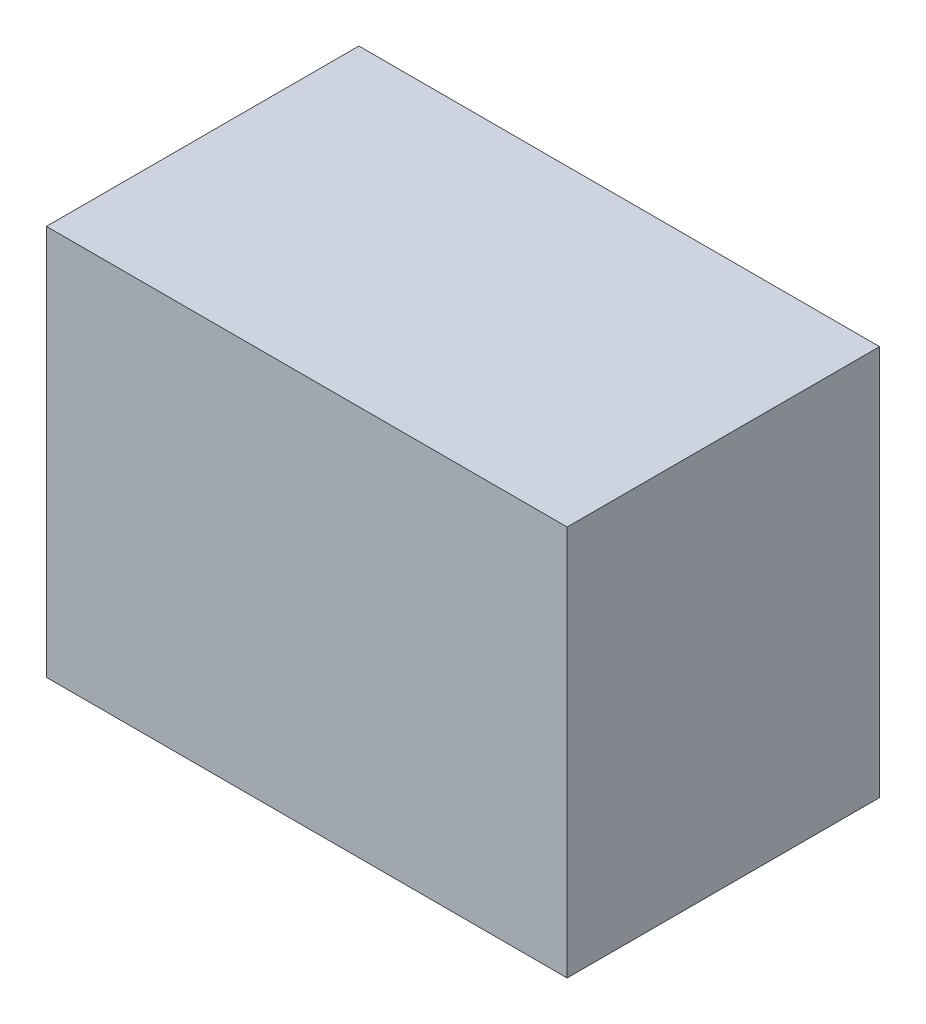
ISO-10303-21;
HEADER;
FILE_DESCRIPTION(('STEP AP214'),'2;1');
FILE_NAME('part.step','',(''),(''),'','','');
FILE_SCHEMA(('AUTOMOTIVE_DESIGN { 1 0 10303 214 1 1 1 1 }'));
ENDSEC;
DATA;
#1=APPLICATION_CONTEXT('core data for automotive mechanical design processes');
#2=APPLICATION_PROTOCOL_DEFINITION('international standard','automotive_design',2000,#1);
#3=PRODUCT_CONTEXT('',#1,'mechanical');
#4=PRODUCT('Part','Part','',(#3));
#5=PRODUCT_RELATED_PRODUCT_CATEGORY('part','',(#4));
#6=PRODUCT_DEFINITION_FORMATION('','',#4);
#7=PRODUCT_DEFINITION_CONTEXT('part definition',#1,'design');
#8=PRODUCT_DEFINITION('design','',#6,#7);
#9=PRODUCT_DEFINITION_SHAPE('','',#8);
#10=(LENGTH_UNIT() NAMED_UNIT(*) SI_UNIT(.MILLI.,.METRE.));
#11=(NAMED_UNIT(*) PLANE_ANGLE_UNIT() SI_UNIT($,.RADIAN.));
#12=(NAMED_UNIT(*) SI_UNIT($,.STERADIAN.) SOLID_ANGLE_UNIT());
#13=UNCERTAINTY_MEASURE_WITH_UNIT(LENGTH_MEASURE(1.E-05),#10,'distance_accuracy_value','');
#14=(GEOMETRIC_REPRESENTATION_CONTEXT(3) GLOBAL_UNCERTAINTY_ASSIGNED_CONTEXT((#13)) GLOBAL_UNIT_ASSIGNED_CONTEXT((#10,
#11,#12)) REPRESENTATION_CONTEXT('',''));
#15=CARTESIAN_POINT('',(0.,0.,0.));
#16=DIRECTION('',(0.,0.,1.));
#17=DIRECTION('',(1.,0.,0.));
#18=AXIS2_PLACEMENT_3D('',#15,#16,#17);
#19=CARTESIAN_POINT('',(0.,0.,12.));
#20=DIRECTION('',(1.,0.,0.));
#21=DIRECTION('',(0.,0.,-1.));
#22=AXIS2_PLACEMENT_3D('',#19,#20,#21);
#23=PLANE('',#22);
#24=DIRECTION('',(0.,-1.,0.));
#25=VECTOR('',#24,1.);
#26=CARTESIAN_POINT('',(0.,0.,0.));
#27=LINE('',#26,#25);
#28=CARTESIAN_POINT('',(0.,15.,0.));
#29=VERTEX_POINT('',#28);
#30=CARTESIAN_POINT('',(0.,0.,0.));
#31=VERTEX_POINT('',#30);
#32=EDGE_CURVE('E164',#29,#31,#27,.T.);
#33=ORIENTED_EDGE('',*,*,#32,.T.);
#34=DIRECTION('',(0.,0.,-1.));
#35=VECTOR('',#34,1.);
#36=CARTESIAN_POINT('',(0.,0.,12.));
#37=LINE('',#36,#35);
#38=CARTESIAN_POINT('',(0.,0.,12.));
#39=VERTEX_POINT('',#38);
#40=EDGE_CURVE('E11',#39,#31,#37,.T.);
#41=ORIENTED_EDGE('',*,*,#40,.F.);
#42=DIRECTION('',(0.,-1.,0.));
#43=VECTOR('',#42,1.);
#44=CARTESIAN_POINT('',(0.,0.,12.));
#45=LINE('',#44,#43);
#46=CARTESIAN_POINT('',(0.,15.,12.));
#47=VERTEX_POINT('',#46);
#48=EDGE_CURVE('E170',#47,#39,#45,.T.);
#49=ORIENTED_EDGE('',*,*,#48,.F.);
#50=DIRECTION('',(0.,0.,-1.));
#51=VECTOR('',#50,1.);
#52=CARTESIAN_POINT('',(0.,15.,12.));
#53=LINE('',#52,#51);
#54=EDGE_CURVE('E180',#47,#29,#53,.T.);
#55=ORIENTED_EDGE('',*,*,#54,.T.);
#56=EDGE_LOOP('',(#33,#41,#49,#55));
#57=FACE_BOUND('',#56,.T.);
#58=ADVANCED_FACE('F45',(#57),#23,.F.);
#59=CARTESIAN_POINT('',(0.,0.,12.));
#60=DIRECTION('',(0.,1.,0.));
#61=DIRECTION('',(0.,0.,1.));
#62=AXIS2_PLACEMENT_3D('',#59,#60,#61);
#63=PLANE('',#62);
#64=DIRECTION('',(1.,0.,0.));
#65=VECTOR('',#64,1.);
#66=CARTESIAN_POINT('',(1.,0.,1.));
#67=LINE('',#66,#65);
#68=CARTESIAN_POINT('',(1.,0.,1.));
#69=VERTEX_POINT('',#68);
#70=CARTESIAN_POINT('',(19.,0.,1.));
#71=VERTEX_POINT('',#70);
#72=EDGE_CURVE('E155',#69,#71,#67,.T.);
#73=ORIENTED_EDGE('',*,*,#72,.F.);
#74=DIRECTION('',(0.,0.,-1.));
#75=VECTOR('',#74,1.);
#76=CARTESIAN_POINT('',(1.,0.,1.));
#77=LINE('',#76,#75);
#78=CARTESIAN_POINT('',(1.,0.,11.));
#79=VERTEX_POINT('',#78);
#80=EDGE_CURVE('E60',#79,#69,#77,.T.);
#81=ORIENTED_EDGE('',*,*,#80,.F.);
#82=DIRECTION('',(-1.,0.,0.));
#83=VECTOR('',#82,1.);
#84=CARTESIAN_POINT('',(1.,0.,11.));
#85=LINE('',#84,#83);
#86=CARTESIAN_POINT('',(19.,0.,11.));
#87=VERTEX_POINT('',#86);
#88=EDGE_CURVE('E142',#87,#79,#85,.T.);
#89=ORIENTED_EDGE('',*,*,#88,.F.);
#90=DIRECTION('',(0.,0.,1.));
#91=VECTOR('',#90,1.);
#92=CARTESIAN_POINT('',(19.,0.,1.));
#93=LINE('',#92,#91);
#94=EDGE_CURVE('E146',#71,#87,#93,.T.);
#95=ORIENTED_EDGE('',*,*,#94,.F.);
#96=EDGE_LOOP('',(#73,#81,#89,#95));
#97=FACE_BOUND('',#96,.T.);
#98=DIRECTION('',(1.,0.,0.));
#99=VECTOR('',#98,1.);
#100=CARTESIAN_POINT('',(0.,0.,0.));
#101=LINE('',#100,#99);
#102=CARTESIAN_POINT('',(20.,0.,0.));
#103=VERTEX_POINT('',#102);
#104=EDGE_CURVE('E184',#31,#103,#101,.T.);
#105=ORIENTED_EDGE('',*,*,#104,.T.);
#106=DIRECTION('',(0.,0.,-1.));
#107=VECTOR('',#106,1.);
#108=CARTESIAN_POINT('',(20.,0.,12.));
#109=LINE('',#108,#107);
#110=CARTESIAN_POINT('',(20.,0.,12.));
#111=VERTEX_POINT('',#110);
#112=EDGE_CURVE('E53',#111,#103,#109,.T.);
#113=ORIENTED_EDGE('',*,*,#112,.F.);
#114=DIRECTION('',(1.,0.,0.));
#115=VECTOR('',#114,1.);
#116=CARTESIAN_POINT('',(0.,0.,12.));
#117=LINE('',#116,#115);
#118=EDGE_CURVE('E97',#39,#111,#117,.T.);
#119=ORIENTED_EDGE('',*,*,#118,.F.);
#120=ORIENTED_EDGE('',*,*,#40,.T.);
#121=EDGE_LOOP('',(#105,#113,#119,#120));
#122=FACE_BOUND('',#121,.T.);
#123=ADVANCED_FACE('F218',(#97,#122),#63,.F.);
#124=CARTESIAN_POINT('',(20.,0.,12.));
#125=DIRECTION('',(-1.,0.,0.));
#126=DIRECTION('',(0.,0.,1.));
#127=AXIS2_PLACEMENT_3D('',#124,#125,#126);
#128=PLANE('',#127);
#129=DIRECTION('',(0.,1.,0.));
#130=VECTOR('',#129,1.);
#131=CARTESIAN_POINT('',(20.,0.,0.));
#132=LINE('',#131,#130);
#133=CARTESIAN_POINT('',(20.,15.,0.));
#134=VERTEX_POINT('',#133);
#135=EDGE_CURVE('E187',#103,#134,#132,.T.);
#136=ORIENTED_EDGE('',*,*,#135,.T.);
#137=DIRECTION('',(0.,0.,-1.));
#138=VECTOR('',#137,1.);
#139=CARTESIAN_POINT('',(20.,15.,12.));
#140=LINE('',#139,#138);
#141=CARTESIAN_POINT('',(20.,15.,12.));
#142=VERTEX_POINT('',#141);
#143=EDGE_CURVE('E194',#142,#134,#140,.T.);
#144=ORIENTED_EDGE('',*,*,#143,.F.);
#145=DIRECTION('',(0.,1.,0.));
#146=VECTOR('',#145,1.);
#147=CARTESIAN_POINT('',(20.,0.,12.));
#148=LINE('',#147,#146);
#149=EDGE_CURVE('E175',#111,#142,#148,.T.);
#150=ORIENTED_EDGE('',*,*,#149,.F.);
#151=ORIENTED_EDGE('',*,*,#112,.T.);
#152=EDGE_LOOP('',(#136,#144,#150,#151));
#153=FACE_BOUND('',#152,.T.);
#154=ADVANCED_FACE('F201',(#153),#128,.F.);
#155=CARTESIAN_POINT('',(0.,15.,12.));
#156=DIRECTION('',(0.,-1.,0.));
#157=DIRECTION('',(0.,0.,-1.));
#158=AXIS2_PLACEMENT_3D('',#155,#156,#157);
#159=PLANE('',#158);
#160=DIRECTION('',(-1.,0.,0.));
#161=VECTOR('',#160,1.);
#162=CARTESIAN_POINT('',(0.,15.,0.));
#163=LINE('',#162,#161);
#164=EDGE_CURVE('E90',#134,#29,#163,.T.);
#165=ORIENTED_EDGE('',*,*,#164,.T.);
#166=ORIENTED_EDGE('',*,*,#54,.F.);
#167=DIRECTION('',(-1.,0.,0.));
#168=VECTOR('',#167,1.);
#169=CARTESIAN_POINT('',(0.,15.,12.));
#170=LINE('',#169,#168);
#171=EDGE_CURVE('E69',#142,#47,#170,.T.);
#172=ORIENTED_EDGE('',*,*,#171,.F.);
#173=ORIENTED_EDGE('',*,*,#143,.T.);
#174=EDGE_LOOP('',(#165,#166,#172,#173));
#175=FACE_BOUND('',#174,.T.);
#176=ADVANCED_FACE('F209',(#175),#159,.F.);
#177=CARTESIAN_POINT('',(0.,0.,12.));
#178=DIRECTION('',(0.,0.,-1.));
#179=DIRECTION('',(-1.,0.,0.));
#180=AXIS2_PLACEMENT_3D('',#177,#178,#179);
#181=PLANE('',#180);
#182=ORIENTED_EDGE('',*,*,#48,.T.);
#183=ORIENTED_EDGE('',*,*,#118,.T.);
#184=ORIENTED_EDGE('',*,*,#149,.T.);
#185=ORIENTED_EDGE('',*,*,#171,.T.);
#186=EDGE_LOOP('',(#182,#183,#184,#185));
#187=FACE_BOUND('',#186,.T.);
#188=ADVANCED_FACE('F211',(#187),#181,.F.);
#189=CARTESIAN_POINT('',(0.,0.,0.));
#190=DIRECTION('',(0.,0.,-1.));
#191=DIRECTION('',(-1.,0.,0.));
#192=AXIS2_PLACEMENT_3D('',#189,#190,#191);
#193=PLANE('',#192);
#194=ORIENTED_EDGE('',*,*,#32,.F.);
#195=ORIENTED_EDGE('',*,*,#164,.F.);
#196=ORIENTED_EDGE('',*,*,#135,.F.);
#197=ORIENTED_EDGE('',*,*,#104,.F.);
#198=EDGE_LOOP('',(#194,#195,#196,#197));
#199=FACE_BOUND('',#198,.T.);
#200=ADVANCED_FACE('F205',(#199),#193,.T.);
#201=CARTESIAN_POINT('',(1.,12.,1.));
#202=DIRECTION('',(-1.,0.,0.));
#203=DIRECTION('',(0.,0.,1.));
#204=AXIS2_PLACEMENT_3D('',#201,#202,#203);
#205=PLANE('',#204);
#206=ORIENTED_EDGE('',*,*,#80,.T.);
#207=DIRECTION('',(0.,-1.,0.));
#208=VECTOR('',#207,1.);
#209=CARTESIAN_POINT('',(1.,12.,1.));
#210=LINE('',#209,#208);
#211=CARTESIAN_POINT('',(1.,12.,1.));
#212=VERTEX_POINT('',#211);
#213=EDGE_CURVE('E117',#212,#69,#210,.T.);
#214=ORIENTED_EDGE('',*,*,#213,.F.);
#215=DIRECTION('',(0.,0.,-1.));
#216=VECTOR('',#215,1.);
#217=CARTESIAN_POINT('',(1.,12.,1.));
#218=LINE('',#217,#216);
#219=CARTESIAN_POINT('',(1.,12.,11.));
#220=VERTEX_POINT('',#219);
#221=EDGE_CURVE('E121',#220,#212,#218,.T.);
#222=ORIENTED_EDGE('',*,*,#221,.F.);
#223=DIRECTION('',(0.,-1.,0.));
#224=VECTOR('',#223,1.);
#225=CARTESIAN_POINT('',(1.,12.,11.));
#226=LINE('',#225,#224);
#227=EDGE_CURVE('E161',#220,#79,#226,.T.);
#228=ORIENTED_EDGE('',*,*,#227,.T.);
#229=EDGE_LOOP('',(#206,#214,#222,#228));
#230=FACE_BOUND('',#229,.T.);
#231=ADVANCED_FACE('F119',(#230),#205,.F.);
#232=CARTESIAN_POINT('',(1.,12.,11.));
#233=DIRECTION('',(0.,0.,1.));
#234=DIRECTION('',(1.,0.,0.));
#235=AXIS2_PLACEMENT_3D('',#232,#233,#234);
#236=PLANE('',#235);
#237=ORIENTED_EDGE('',*,*,#88,.T.);
#238=ORIENTED_EDGE('',*,*,#227,.F.);
#239=DIRECTION('',(-1.,0.,0.));
#240=VECTOR('',#239,1.);
#241=CARTESIAN_POINT('',(1.,12.,11.));
#242=LINE('',#241,#240);
#243=CARTESIAN_POINT('',(19.,12.,11.));
#244=VERTEX_POINT('',#243);
#245=EDGE_CURVE('E128',#244,#220,#242,.T.);
#246=ORIENTED_EDGE('',*,*,#245,.F.);
#247=DIRECTION('',(0.,-1.,0.));
#248=VECTOR('',#247,1.);
#249=CARTESIAN_POINT('',(19.,12.,11.));
#250=LINE('',#249,#248);
#251=EDGE_CURVE('E165',#244,#87,#250,.T.);
#252=ORIENTED_EDGE('',*,*,#251,.T.);
#253=EDGE_LOOP('',(#237,#238,#246,#252));
#254=FACE_BOUND('',#253,.T.);
#255=ADVANCED_FACE('F233',(#254),#236,.F.);
#256=CARTESIAN_POINT('',(19.,12.,1.));
#257=DIRECTION('',(1.,0.,0.));
#258=DIRECTION('',(0.,0.,-1.));
#259=AXIS2_PLACEMENT_3D('',#256,#257,#258);
#260=PLANE('',#259);
#261=ORIENTED_EDGE('',*,*,#94,.T.);
#262=ORIENTED_EDGE('',*,*,#251,.F.);
#263=DIRECTION('',(0.,0.,1.));
#264=VECTOR('',#263,1.);
#265=CARTESIAN_POINT('',(19.,12.,1.));
#266=LINE('',#265,#264);
#267=CARTESIAN_POINT('',(19.,12.,1.));
#268=VERTEX_POINT('',#267);
#269=EDGE_CURVE('E137',#268,#244,#266,.T.);
#270=ORIENTED_EDGE('',*,*,#269,.F.);
#271=DIRECTION('',(0.,-1.,0.));
#272=VECTOR('',#271,1.);
#273=CARTESIAN_POINT('',(19.,12.,1.));
#274=LINE('',#273,#272);
#275=EDGE_CURVE('E127',#268,#71,#274,.T.);
#276=ORIENTED_EDGE('',*,*,#275,.T.);
#277=EDGE_LOOP('',(#261,#262,#270,#276));
#278=FACE_BOUND('',#277,.T.);
#279=ADVANCED_FACE('F231',(#278),#260,.F.);
#280=CARTESIAN_POINT('',(1.,12.,1.));
#281=DIRECTION('',(0.,0.,-1.));
#282=DIRECTION('',(-1.,0.,0.));
#283=AXIS2_PLACEMENT_3D('',#280,#281,#282);
#284=PLANE('',#283);
#285=ORIENTED_EDGE('',*,*,#72,.T.);
#286=ORIENTED_EDGE('',*,*,#275,.F.);
#287=DIRECTION('',(1.,0.,0.));
#288=VECTOR('',#287,1.);
#289=CARTESIAN_POINT('',(1.,12.,1.));
#290=LINE('',#289,#288);
#291=EDGE_CURVE('E131',#212,#268,#290,.T.);
#292=ORIENTED_EDGE('',*,*,#291,.F.);
#293=ORIENTED_EDGE('',*,*,#213,.T.);
#294=EDGE_LOOP('',(#285,#286,#292,#293));
#295=FACE_BOUND('',#294,.T.);
#296=ADVANCED_FACE('F132',(#295),#284,.F.);
#297=CARTESIAN_POINT('',(0.,12.,0.));
#298=DIRECTION('',(0.,1.,0.));
#299=DIRECTION('',(0.,0.,1.));
#300=AXIS2_PLACEMENT_3D('',#297,#298,#299);
#301=PLANE('',#300);
#302=ORIENTED_EDGE('',*,*,#221,.T.);
#303=ORIENTED_EDGE('',*,*,#291,.T.);
#304=ORIENTED_EDGE('',*,*,#269,.T.);
#305=ORIENTED_EDGE('',*,*,#245,.T.);
#306=EDGE_LOOP('',(#302,#303,#304,#305));
#307=FACE_BOUND('',#306,.T.);
#308=ADVANCED_FACE('F139',(#307),#301,.F.);
#309=CLOSED_SHELL('',(#58,#123,#154,#176,#188,#200,#231,#255,#279,#296,#308));
#310=MANIFOLD_SOLID_BREP('B2',#309);
#311=ADVANCED_BREP_SHAPE_REPRESENTATION('',(#18,#310),#14);
#312=SHAPE_DEFINITION_REPRESENTATION(#9,#311);
ENDSEC;
END-ISO-10303-21;
